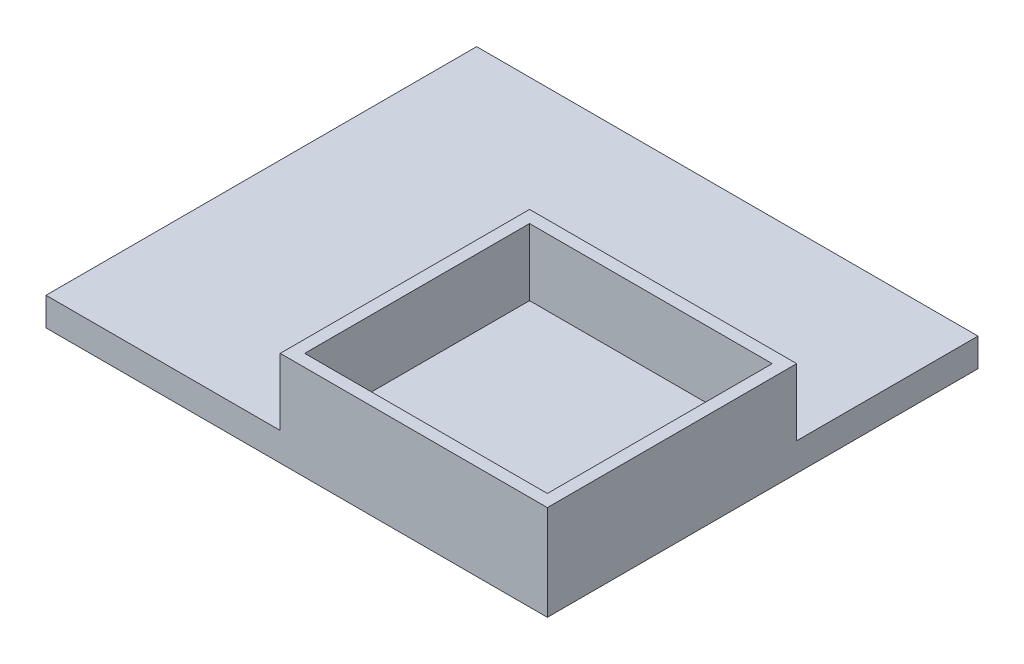
ISO-10303-21;
HEADER;
FILE_DESCRIPTION(('STEP AP214'),'2;1');
FILE_NAME('part.step','',(''),(''),'','','');
FILE_SCHEMA(('AUTOMOTIVE_DESIGN { 1 0 10303 214 1 1 1 1 }'));
ENDSEC;
DATA;
#1=APPLICATION_CONTEXT('core data for automotive mechanical design processes');
#2=APPLICATION_PROTOCOL_DEFINITION('international standard','automotive_design',2000,#1);
#3=PRODUCT_CONTEXT('',#1,'mechanical');
#4=PRODUCT('Part','Part','',(#3));
#5=PRODUCT_RELATED_PRODUCT_CATEGORY('part','',(#4));
#6=PRODUCT_DEFINITION_FORMATION('','',#4);
#7=PRODUCT_DEFINITION_CONTEXT('part definition',#1,'design');
#8=PRODUCT_DEFINITION('design','',#6,#7);
#9=PRODUCT_DEFINITION_SHAPE('','',#8);
#10=(LENGTH_UNIT() NAMED_UNIT(*) SI_UNIT(.MILLI.,.METRE.));
#11=(NAMED_UNIT(*) PLANE_ANGLE_UNIT() SI_UNIT($,.RADIAN.));
#12=(NAMED_UNIT(*) SI_UNIT($,.STERADIAN.) SOLID_ANGLE_UNIT());
#13=UNCERTAINTY_MEASURE_WITH_UNIT(LENGTH_MEASURE(1.E-05),#10,'distance_accuracy_value','');
#14=(GEOMETRIC_REPRESENTATION_CONTEXT(3) GLOBAL_UNCERTAINTY_ASSIGNED_CONTEXT((#13)) GLOBAL_UNIT_ASSIGNED_CONTEXT((#10,
#11,#12)) REPRESENTATION_CONTEXT('',''));
#15=CARTESIAN_POINT('',(0.,0.,0.));
#16=DIRECTION('',(0.,0.,1.));
#17=DIRECTION('',(1.,0.,0.));
#18=AXIS2_PLACEMENT_3D('',#15,#16,#17);
#19=CARTESIAN_POINT('',(56.3,6.35,-20.36));
#20=DIRECTION('',(-1.,0.,0.));
#21=DIRECTION('',(0.,0.,1.));
#22=AXIS2_PLACEMENT_3D('',#19,#20,#21);
#23=PLANE('',#22);
#24=DIRECTION('',(0.,0.,-1.));
#25=VECTOR('',#24,1.);
#26=CARTESIAN_POINT('',(56.3,0.,-20.36));
#27=LINE('',#26,#25);
#28=CARTESIAN_POINT('',(56.3,0.,76.36));
#29=VERTEX_POINT('',#28);
#30=CARTESIAN_POINT('',(56.3,0.,-20.36));
#31=VERTEX_POINT('',#30);
#32=EDGE_CURVE('E220',#29,#31,#27,.T.);
#33=ORIENTED_EDGE('',*,*,#32,.T.);
#34=DIRECTION('',(0.,-1.,0.));
#35=VECTOR('',#34,1.);
#36=CARTESIAN_POINT('',(56.3,6.35,-20.36));
#37=LINE('',#36,#35);
#38=CARTESIAN_POINT('',(56.3,6.35,-20.36));
#39=VERTEX_POINT('',#38);
#40=EDGE_CURVE('E11',#39,#31,#37,.T.);
#41=ORIENTED_EDGE('',*,*,#40,.F.);
#42=DIRECTION('',(0.,0.,-1.));
#43=VECTOR('',#42,1.);
#44=CARTESIAN_POINT('',(56.3,6.35,-20.36));
#45=LINE('',#44,#43);
#46=CARTESIAN_POINT('',(56.3,6.35,20.36));
#47=VERTEX_POINT('',#46);
#48=EDGE_CURVE('E221',#47,#39,#45,.T.);
#49=ORIENTED_EDGE('',*,*,#48,.F.);
#50=DIRECTION('',(0.,-1.,0.));
#51=VECTOR('',#50,1.);
#52=CARTESIAN_POINT('',(56.3,21.35,20.36));
#53=LINE('',#52,#51);
#54=CARTESIAN_POINT('',(56.3,21.35,20.36));
#55=VERTEX_POINT('',#54);
#56=EDGE_CURVE('E203',#55,#47,#53,.T.);
#57=ORIENTED_EDGE('',*,*,#56,.F.);
#58=DIRECTION('',(0.,0.,-1.));
#59=VECTOR('',#58,1.);
#60=CARTESIAN_POINT('',(56.3,21.35,20.36));
#61=LINE('',#60,#59);
#62=CARTESIAN_POINT('',(56.3,21.35,76.36));
#63=VERTEX_POINT('',#62);
#64=EDGE_CURVE('E175',#63,#55,#61,.T.);
#65=ORIENTED_EDGE('',*,*,#64,.F.);
#66=DIRECTION('',(0.,1.,0.));
#67=VECTOR('',#66,1.);
#68=CARTESIAN_POINT('',(56.3,6.35,76.36));
#69=LINE('',#68,#67);
#70=EDGE_CURVE('E215',#29,#63,#69,.T.);
#71=ORIENTED_EDGE('',*,*,#70,.F.);
#72=EDGE_LOOP('',(#33,#41,#49,#57,#65,#71));
#73=FACE_BOUND('',#72,.T.);
#74=ADVANCED_FACE('F39',(#73),#23,.F.);
#75=CARTESIAN_POINT('',(-56.3,6.35,-20.36));
#76=DIRECTION('',(0.,0.,1.));
#77=DIRECTION('',(1.,0.,0.));
#78=AXIS2_PLACEMENT_3D('',#75,#76,#77);
#79=PLANE('',#78);
#80=DIRECTION('',(-1.,0.,0.));
#81=VECTOR('',#80,1.);
#82=CARTESIAN_POINT('',(-56.3,0.,-20.36));
#83=LINE('',#82,#81);
#84=CARTESIAN_POINT('',(-56.3,0.,-20.36));
#85=VERTEX_POINT('',#84);
#86=EDGE_CURVE('E234',#31,#85,#83,.T.);
#87=ORIENTED_EDGE('',*,*,#86,.T.);
#88=DIRECTION('',(0.,-1.,0.));
#89=VECTOR('',#88,1.);
#90=CARTESIAN_POINT('',(-56.3,6.35,-20.36));
#91=LINE('',#90,#89);
#92=CARTESIAN_POINT('',(-56.3,6.35,-20.36));
#93=VERTEX_POINT('',#92);
#94=EDGE_CURVE('E47',#93,#85,#91,.T.);
#95=ORIENTED_EDGE('',*,*,#94,.F.);
#96=DIRECTION('',(-1.,0.,0.));
#97=VECTOR('',#96,1.);
#98=CARTESIAN_POINT('',(-56.3,6.35,-20.36));
#99=LINE('',#98,#97);
#100=EDGE_CURVE('E224',#39,#93,#99,.T.);
#101=ORIENTED_EDGE('',*,*,#100,.F.);
#102=ORIENTED_EDGE('',*,*,#40,.T.);
#103=EDGE_LOOP('',(#87,#95,#101,#102));
#104=FACE_BOUND('',#103,.T.);
#105=ADVANCED_FACE('F259',(#104),#79,.F.);
#106=CARTESIAN_POINT('',(-56.3,6.35,-20.36));
#107=DIRECTION('',(1.,0.,0.));
#108=DIRECTION('',(0.,0.,-1.));
#109=AXIS2_PLACEMENT_3D('',#106,#107,#108);
#110=PLANE('',#109);
#111=DIRECTION('',(0.,0.,1.));
#112=VECTOR('',#111,1.);
#113=CARTESIAN_POINT('',(-56.3,0.,-20.36));
#114=LINE('',#113,#112);
#115=CARTESIAN_POINT('',(-56.3,0.,76.36));
#116=VERTEX_POINT('',#115);
#117=EDGE_CURVE('E225',#85,#116,#114,.T.);
#118=ORIENTED_EDGE('',*,*,#117,.T.);
#119=DIRECTION('',(0.,-1.,0.));
#120=VECTOR('',#119,1.);
#121=CARTESIAN_POINT('',(-56.3,6.35,76.36));
#122=LINE('',#121,#120);
#123=CARTESIAN_POINT('',(-56.3,6.35,76.36));
#124=VERTEX_POINT('',#123);
#125=EDGE_CURVE('E207',#124,#116,#122,.T.);
#126=ORIENTED_EDGE('',*,*,#125,.F.);
#127=DIRECTION('',(0.,0.,1.));
#128=VECTOR('',#127,1.);
#129=CARTESIAN_POINT('',(-56.3,6.35,-20.36));
#130=LINE('',#129,#128);
#131=EDGE_CURVE('E228',#93,#124,#130,.T.);
#132=ORIENTED_EDGE('',*,*,#131,.F.);
#133=ORIENTED_EDGE('',*,*,#94,.T.);
#134=EDGE_LOOP('',(#118,#126,#132,#133));
#135=FACE_BOUND('',#134,.T.);
#136=ADVANCED_FACE('F244',(#135),#110,.F.);
#137=CARTESIAN_POINT('',(0.,6.35,0.));
#138=DIRECTION('',(0.,1.,0.));
#139=DIRECTION('',(0.,0.,1.));
#140=AXIS2_PLACEMENT_3D('',#137,#138,#139);
#141=PLANE('',#140);
#142=DIRECTION('',(0.,0.,1.));
#143=VECTOR('',#142,1.);
#144=CARTESIAN_POINT('',(-3.69999999999999,6.35,76.36));
#145=LINE('',#144,#143);
#146=CARTESIAN_POINT('',(-3.69999999999999,6.35,20.36));
#147=VERTEX_POINT('',#146);
#148=CARTESIAN_POINT('',(-3.69999999999999,6.35,76.36));
#149=VERTEX_POINT('',#148);
#150=EDGE_CURVE('E180',#147,#149,#145,.T.);
#151=ORIENTED_EDGE('',*,*,#150,.F.);
#152=DIRECTION('',(-1.,0.,0.));
#153=VECTOR('',#152,1.);
#154=CARTESIAN_POINT('',(-3.69999999999999,6.35,20.36));
#155=LINE('',#154,#153);
#156=EDGE_CURVE('E142',#47,#147,#155,.T.);
#157=ORIENTED_EDGE('',*,*,#156,.F.);
#158=ORIENTED_EDGE('',*,*,#48,.T.);
#159=ORIENTED_EDGE('',*,*,#100,.T.);
#160=ORIENTED_EDGE('',*,*,#131,.T.);
#161=DIRECTION('',(-1.,0.,0.));
#162=VECTOR('',#161,1.);
#163=CARTESIAN_POINT('',(-56.3,6.35,76.36));
#164=LINE('',#163,#162);
#165=EDGE_CURVE('E62',#149,#124,#164,.T.);
#166=ORIENTED_EDGE('',*,*,#165,.F.);
#167=EDGE_LOOP('',(#151,#157,#158,#159,#160,#166));
#168=FACE_BOUND('',#167,.T.);
#169=ADVANCED_FACE('F256',(#168),#141,.T.);
#170=CARTESIAN_POINT('',(0.,0.,0.));
#171=DIRECTION('',(0.,1.,0.));
#172=DIRECTION('',(0.,0.,1.));
#173=AXIS2_PLACEMENT_3D('',#170,#171,#172);
#174=PLANE('',#173);
#175=ORIENTED_EDGE('',*,*,#32,.F.);
#176=DIRECTION('',(1.,0.,0.));
#177=VECTOR('',#176,1.);
#178=CARTESIAN_POINT('',(-56.3,0.,76.36));
#179=LINE('',#178,#177);
#180=EDGE_CURVE('E211',#116,#29,#179,.T.);
#181=ORIENTED_EDGE('',*,*,#180,.F.);
#182=ORIENTED_EDGE('',*,*,#117,.F.);
#183=ORIENTED_EDGE('',*,*,#86,.F.);
#184=EDGE_LOOP('',(#175,#181,#182,#183));
#185=FACE_BOUND('',#184,.T.);
#186=ADVANCED_FACE('F250',(#185),#174,.F.);
#187=CARTESIAN_POINT('',(0.,0.,76.36));
#188=DIRECTION('',(0.,0.,1.));
#189=DIRECTION('',(1.,0.,0.));
#190=AXIS2_PLACEMENT_3D('',#187,#188,#189);
#191=PLANE('',#190);
#192=ORIENTED_EDGE('',*,*,#125,.T.);
#193=ORIENTED_EDGE('',*,*,#180,.T.);
#194=ORIENTED_EDGE('',*,*,#70,.T.);
#195=DIRECTION('',(1.,0.,0.));
#196=VECTOR('',#195,1.);
#197=CARTESIAN_POINT('',(56.3,21.35,76.36));
#198=LINE('',#197,#196);
#199=CARTESIAN_POINT('',(-3.69999999999999,21.35,76.36));
#200=VERTEX_POINT('',#199);
#201=EDGE_CURVE('E186',#200,#63,#198,.T.);
#202=ORIENTED_EDGE('',*,*,#201,.F.);
#203=DIRECTION('',(0.,-1.,0.));
#204=VECTOR('',#203,1.);
#205=CARTESIAN_POINT('',(-3.69999999999999,21.35,76.36));
#206=LINE('',#205,#204);
#207=EDGE_CURVE('E190',#200,#149,#206,.T.);
#208=ORIENTED_EDGE('',*,*,#207,.T.);
#209=ORIENTED_EDGE('',*,*,#165,.T.);
#210=EDGE_LOOP('',(#192,#193,#194,#202,#208,#209));
#211=FACE_BOUND('',#210,.T.);
#212=ADVANCED_FACE('F253',(#211),#191,.T.);
#213=CARTESIAN_POINT('',(0.,21.35,0.));
#214=DIRECTION('',(0.,-1.,0.));
#215=DIRECTION('',(0.,0.,-1.));
#216=AXIS2_PLACEMENT_3D('',#213,#214,#215);
#217=PLANE('',#216);
#218=ORIENTED_EDGE('',*,*,#64,.T.);
#219=DIRECTION('',(-1.,0.,0.));
#220=VECTOR('',#219,1.);
#221=CARTESIAN_POINT('',(-3.69999999999999,21.35,20.36));
#222=LINE('',#221,#220);
#223=CARTESIAN_POINT('',(-3.69999999999999,21.35,20.36));
#224=VERTEX_POINT('',#223);
#225=EDGE_CURVE('E179',#55,#224,#222,.T.);
#226=ORIENTED_EDGE('',*,*,#225,.T.);
#227=DIRECTION('',(0.,0.,1.));
#228=VECTOR('',#227,1.);
#229=CARTESIAN_POINT('',(-3.69999999999999,21.35,76.36));
#230=LINE('',#229,#228);
#231=EDGE_CURVE('E183',#224,#200,#230,.T.);
#232=ORIENTED_EDGE('',*,*,#231,.T.);
#233=ORIENTED_EDGE('',*,*,#201,.T.);
#234=EDGE_LOOP('',(#218,#226,#232,#233));
#235=FACE_BOUND('',#234,.T.);
#236=DIRECTION('',(0.,0.,1.));
#237=VECTOR('',#236,1.);
#238=CARTESIAN_POINT('',(-0.949999999999989,21.35,73.61));
#239=LINE('',#238,#237);
#240=CARTESIAN_POINT('',(-0.949999999999993,21.35,23.11));
#241=VERTEX_POINT('',#240);
#242=CARTESIAN_POINT('',(-0.949999999999989,21.35,73.61));
#243=VERTEX_POINT('',#242);
#244=EDGE_CURVE('E124',#241,#243,#239,.T.);
#245=ORIENTED_EDGE('',*,*,#244,.F.);
#246=DIRECTION('',(-1.,0.,0.));
#247=VECTOR('',#246,1.);
#248=CARTESIAN_POINT('',(-0.949999999999993,21.35,23.11));
#249=LINE('',#248,#247);
#250=CARTESIAN_POINT('',(53.55,21.35,23.11));
#251=VERTEX_POINT('',#250);
#252=EDGE_CURVE('E152',#251,#241,#249,.T.);
#253=ORIENTED_EDGE('',*,*,#252,.F.);
#254=DIRECTION('',(0.,0.,-1.));
#255=VECTOR('',#254,1.);
#256=CARTESIAN_POINT('',(53.55,21.35,23.11));
#257=LINE('',#256,#255);
#258=CARTESIAN_POINT('',(53.55,21.35,73.61));
#259=VERTEX_POINT('',#258);
#260=EDGE_CURVE('E148',#259,#251,#257,.T.);
#261=ORIENTED_EDGE('',*,*,#260,.F.);
#262=DIRECTION('',(1.,0.,0.));
#263=VECTOR('',#262,1.);
#264=CARTESIAN_POINT('',(53.55,21.35,73.61));
#265=LINE('',#264,#263);
#266=EDGE_CURVE('E134',#243,#259,#265,.T.);
#267=ORIENTED_EDGE('',*,*,#266,.F.);
#268=EDGE_LOOP('',(#245,#253,#261,#267));
#269=FACE_BOUND('',#268,.T.);
#270=ADVANCED_FACE('F146',(#235,#269),#217,.F.);
#271=CARTESIAN_POINT('',(-3.69999999999999,21.35,20.36));
#272=DIRECTION('',(0.,0.,1.));
#273=DIRECTION('',(1.,0.,0.));
#274=AXIS2_PLACEMENT_3D('',#271,#272,#273);
#275=PLANE('',#274);
#276=ORIENTED_EDGE('',*,*,#156,.T.);
#277=DIRECTION('',(0.,-1.,0.));
#278=VECTOR('',#277,1.);
#279=CARTESIAN_POINT('',(-3.69999999999999,21.35,20.36));
#280=LINE('',#279,#278);
#281=EDGE_CURVE('E199',#224,#147,#280,.T.);
#282=ORIENTED_EDGE('',*,*,#281,.F.);
#283=ORIENTED_EDGE('',*,*,#225,.F.);
#284=ORIENTED_EDGE('',*,*,#56,.T.);
#285=EDGE_LOOP('',(#276,#282,#283,#284));
#286=FACE_BOUND('',#285,.T.);
#287=ADVANCED_FACE('F269',(#286),#275,.F.);
#288=CARTESIAN_POINT('',(-3.69999999999999,21.35,76.36));
#289=DIRECTION('',(1.,0.,0.));
#290=DIRECTION('',(0.,0.,-1.));
#291=AXIS2_PLACEMENT_3D('',#288,#289,#290);
#292=PLANE('',#291);
#293=ORIENTED_EDGE('',*,*,#150,.T.);
#294=ORIENTED_EDGE('',*,*,#207,.F.);
#295=ORIENTED_EDGE('',*,*,#231,.F.);
#296=ORIENTED_EDGE('',*,*,#281,.T.);
#297=EDGE_LOOP('',(#293,#294,#295,#296));
#298=FACE_BOUND('',#297,.T.);
#299=ADVANCED_FACE('F267',(#298),#292,.F.);
#300=CARTESIAN_POINT('',(-0.949999999999989,21.35,73.61));
#301=DIRECTION('',(1.,0.,0.));
#302=DIRECTION('',(0.,0.,-1.));
#303=AXIS2_PLACEMENT_3D('',#300,#301,#302);
#304=PLANE('',#303);
#305=DIRECTION('',(0.,0.,1.));
#306=VECTOR('',#305,1.);
#307=CARTESIAN_POINT('',(-0.949999999999989,6.35,73.61));
#308=LINE('',#307,#306);
#309=CARTESIAN_POINT('',(-0.949999999999993,6.35,23.11));
#310=VERTEX_POINT('',#309);
#311=CARTESIAN_POINT('',(-0.949999999999989,6.35,73.61));
#312=VERTEX_POINT('',#311);
#313=EDGE_CURVE('E157',#310,#312,#308,.T.);
#314=ORIENTED_EDGE('',*,*,#313,.F.);
#315=DIRECTION('',(0.,-1.,0.));
#316=VECTOR('',#315,1.);
#317=CARTESIAN_POINT('',(-0.949999999999993,21.35,23.11));
#318=LINE('',#317,#316);
#319=EDGE_CURVE('E129',#241,#310,#318,.T.);
#320=ORIENTED_EDGE('',*,*,#319,.F.);
#321=ORIENTED_EDGE('',*,*,#244,.T.);
#322=DIRECTION('',(0.,-1.,0.));
#323=VECTOR('',#322,1.);
#324=CARTESIAN_POINT('',(-0.949999999999989,21.35,73.61));
#325=LINE('',#324,#323);
#326=EDGE_CURVE('E127',#243,#312,#325,.T.);
#327=ORIENTED_EDGE('',*,*,#326,.T.);
#328=EDGE_LOOP('',(#314,#320,#321,#327));
#329=FACE_BOUND('',#328,.T.);
#330=ADVANCED_FACE('F126',(#329),#304,.T.);
#331=CARTESIAN_POINT('',(53.55,21.35,73.61));
#332=DIRECTION('',(0.,0.,-1.));
#333=DIRECTION('',(-1.,0.,0.));
#334=AXIS2_PLACEMENT_3D('',#331,#332,#333);
#335=PLANE('',#334);
#336=DIRECTION('',(1.,0.,0.));
#337=VECTOR('',#336,1.);
#338=CARTESIAN_POINT('',(53.55,6.35,73.61));
#339=LINE('',#338,#337);
#340=CARTESIAN_POINT('',(53.55,6.35,73.61));
#341=VERTEX_POINT('',#340);
#342=EDGE_CURVE('E140',#312,#341,#339,.T.);
#343=ORIENTED_EDGE('',*,*,#342,.F.);
#344=ORIENTED_EDGE('',*,*,#326,.F.);
#345=ORIENTED_EDGE('',*,*,#266,.T.);
#346=DIRECTION('',(0.,-1.,0.));
#347=VECTOR('',#346,1.);
#348=CARTESIAN_POINT('',(53.55,21.35,73.61));
#349=LINE('',#348,#347);
#350=EDGE_CURVE('E143',#259,#341,#349,.T.);
#351=ORIENTED_EDGE('',*,*,#350,.T.);
#352=EDGE_LOOP('',(#343,#344,#345,#351));
#353=FACE_BOUND('',#352,.T.);
#354=ADVANCED_FACE('F137',(#353),#335,.T.);
#355=CARTESIAN_POINT('',(53.55,21.35,23.11));
#356=DIRECTION('',(-1.,0.,0.));
#357=DIRECTION('',(0.,0.,1.));
#358=AXIS2_PLACEMENT_3D('',#355,#356,#357);
#359=PLANE('',#358);
#360=DIRECTION('',(0.,0.,-1.));
#361=VECTOR('',#360,1.);
#362=CARTESIAN_POINT('',(53.55,6.35,23.11));
#363=LINE('',#362,#361);
#364=CARTESIAN_POINT('',(53.55,6.35,23.11));
#365=VERTEX_POINT('',#364);
#366=EDGE_CURVE('E162',#341,#365,#363,.T.);
#367=ORIENTED_EDGE('',*,*,#366,.F.);
#368=ORIENTED_EDGE('',*,*,#350,.F.);
#369=ORIENTED_EDGE('',*,*,#260,.T.);
#370=DIRECTION('',(0.,-1.,0.));
#371=VECTOR('',#370,1.);
#372=CARTESIAN_POINT('',(53.55,21.35,23.11));
#373=LINE('',#372,#371);
#374=EDGE_CURVE('E170',#251,#365,#373,.T.);
#375=ORIENTED_EDGE('',*,*,#374,.T.);
#376=EDGE_LOOP('',(#367,#368,#369,#375));
#377=FACE_BOUND('',#376,.T.);
#378=ADVANCED_FACE('F329',(#377),#359,.T.);
#379=CARTESIAN_POINT('',(-0.949999999999993,21.35,23.11));
#380=DIRECTION('',(0.,0.,1.));
#381=DIRECTION('',(1.,0.,0.));
#382=AXIS2_PLACEMENT_3D('',#379,#380,#381);
#383=PLANE('',#382);
#384=DIRECTION('',(-1.,0.,0.));
#385=VECTOR('',#384,1.);
#386=CARTESIAN_POINT('',(-0.949999999999993,6.35,23.11));
#387=LINE('',#386,#385);
#388=EDGE_CURVE('E54',#365,#310,#387,.T.);
#389=ORIENTED_EDGE('',*,*,#388,.F.);
#390=ORIENTED_EDGE('',*,*,#374,.F.);
#391=ORIENTED_EDGE('',*,*,#252,.T.);
#392=ORIENTED_EDGE('',*,*,#319,.T.);
#393=EDGE_LOOP('',(#389,#390,#391,#392));
#394=FACE_BOUND('',#393,.T.);
#395=ADVANCED_FACE('F338',(#394),#383,.T.);
#396=ORIENTED_EDGE('',*,*,#366,.T.);
#397=ORIENTED_EDGE('',*,*,#388,.T.);
#398=ORIENTED_EDGE('',*,*,#313,.T.);
#399=ORIENTED_EDGE('',*,*,#342,.T.);
#400=EDGE_LOOP('',(#396,#397,#398,#399));
#401=FACE_BOUND('',#400,.T.);
#402=ADVANCED_FACE('F291',(#401),#141,.T.);
#403=CLOSED_SHELL('',(#74,#105,#136,#169,#186,#212,#270,#287,#299,#330,#354,#378,#395,#402));
#404=MANIFOLD_SOLID_BREP('B2',#403);
#405=ADVANCED_BREP_SHAPE_REPRESENTATION('',(#18,#404),#14);
#406=SHAPE_DEFINITION_REPRESENTATION(#9,#405);
ENDSEC;
END-ISO-10303-21;
